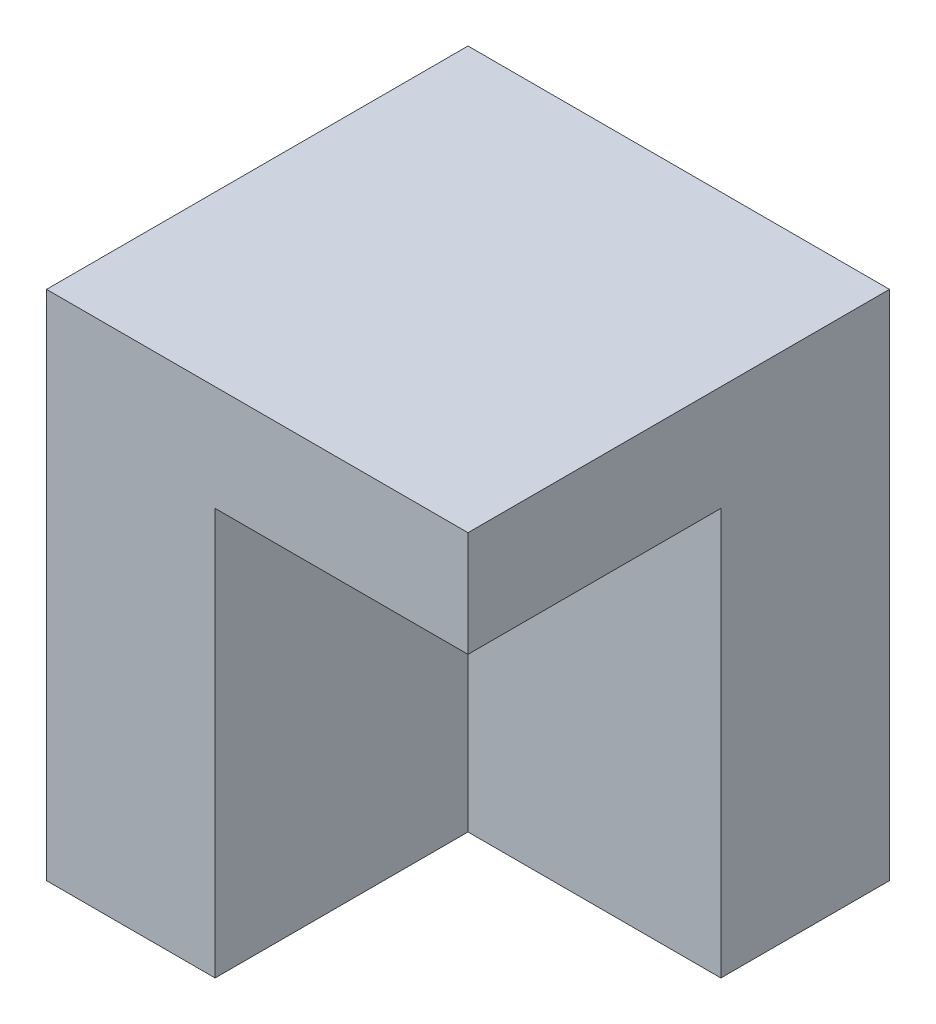
ISO-10303-21;
HEADER;
FILE_DESCRIPTION(('STEP AP214'),'2;1');
FILE_NAME('part.step','',(''),(''),'','','');
FILE_SCHEMA(('AUTOMOTIVE_DESIGN { 1 0 10303 214 1 1 1 1 }'));
ENDSEC;
DATA;
#1=APPLICATION_CONTEXT('core data for automotive mechanical design processes');
#2=APPLICATION_PROTOCOL_DEFINITION('international standard','automotive_design',2000,#1);
#3=PRODUCT_CONTEXT('',#1,'mechanical');
#4=PRODUCT('Part','Part','',(#3));
#5=PRODUCT_RELATED_PRODUCT_CATEGORY('part','',(#4));
#6=PRODUCT_DEFINITION_FORMATION('','',#4);
#7=PRODUCT_DEFINITION_CONTEXT('part definition',#1,'design');
#8=PRODUCT_DEFINITION('design','',#6,#7);
#9=PRODUCT_DEFINITION_SHAPE('','',#8);
#10=(LENGTH_UNIT() NAMED_UNIT(*) SI_UNIT(.MILLI.,.METRE.));
#11=(NAMED_UNIT(*) PLANE_ANGLE_UNIT() SI_UNIT($,.RADIAN.));
#12=(NAMED_UNIT(*) SI_UNIT($,.STERADIAN.) SOLID_ANGLE_UNIT());
#13=UNCERTAINTY_MEASURE_WITH_UNIT(LENGTH_MEASURE(1.E-05),#10,'distance_accuracy_value','');
#14=(GEOMETRIC_REPRESENTATION_CONTEXT(3) GLOBAL_UNCERTAINTY_ASSIGNED_CONTEXT((#13)) GLOBAL_UNIT_ASSIGNED_CONTEXT((#10,
#11,#12)) REPRESENTATION_CONTEXT('',''));
#15=CARTESIAN_POINT('',(0.,0.,0.));
#16=DIRECTION('',(0.,0.,1.));
#17=DIRECTION('',(1.,0.,0.));
#18=AXIS2_PLACEMENT_3D('',#15,#16,#17);
#19=CARTESIAN_POINT('',(0.,0.,0.));
#20=DIRECTION('',(0.,-1.,0.));
#21=DIRECTION('',(0.,0.,-1.));
#22=AXIS2_PLACEMENT_3D('',#19,#20,#21);
#23=PLANE('',#22);
#24=DIRECTION('',(1.,0.,0.));
#25=VECTOR('',#24,1.);
#26=CARTESIAN_POINT('',(10.,0.,4.));
#27=LINE('',#26,#25);
#28=CARTESIAN_POINT('',(4.,0.,4.));
#29=VERTEX_POINT('',#28);
#30=CARTESIAN_POINT('',(10.,0.,4.));
#31=VERTEX_POINT('',#30);
#32=EDGE_CURVE('E101',#29,#31,#27,.T.);
#33=ORIENTED_EDGE('',*,*,#32,.F.);
#34=DIRECTION('',(0.,0.,-1.));
#35=VECTOR('',#34,1.);
#36=CARTESIAN_POINT('',(4.,0.,10.));
#37=LINE('',#36,#35);
#38=CARTESIAN_POINT('',(4.,0.,10.));
#39=VERTEX_POINT('',#38);
#40=EDGE_CURVE('E88',#39,#29,#37,.T.);
#41=ORIENTED_EDGE('',*,*,#40,.F.);
#42=DIRECTION('',(1.,0.,0.));
#43=VECTOR('',#42,1.);
#44=CARTESIAN_POINT('',(4.,0.,10.));
#45=LINE('',#44,#43);
#46=CARTESIAN_POINT('',(0.,0.,10.));
#47=VERTEX_POINT('',#46);
#48=EDGE_CURVE('E83',#47,#39,#45,.T.);
#49=ORIENTED_EDGE('',*,*,#48,.F.);
#50=DIRECTION('',(0.,0.,1.));
#51=VECTOR('',#50,1.);
#52=CARTESIAN_POINT('',(0.,0.,10.));
#53=LINE('',#52,#51);
#54=CARTESIAN_POINT('',(0.,0.,0.));
#55=VERTEX_POINT('',#54);
#56=EDGE_CURVE('E124',#55,#47,#53,.T.);
#57=ORIENTED_EDGE('',*,*,#56,.F.);
#58=DIRECTION('',(-1.,0.,0.));
#59=VECTOR('',#58,1.);
#60=CARTESIAN_POINT('',(0.,0.,0.));
#61=LINE('',#60,#59);
#62=CARTESIAN_POINT('',(10.,0.,0.));
#63=VERTEX_POINT('',#62);
#64=EDGE_CURVE('E114',#63,#55,#61,.T.);
#65=ORIENTED_EDGE('',*,*,#64,.F.);
#66=DIRECTION('',(0.,0.,-1.));
#67=VECTOR('',#66,1.);
#68=CARTESIAN_POINT('',(10.,0.,0.));
#69=LINE('',#68,#67);
#70=EDGE_CURVE('E108',#31,#63,#69,.T.);
#71=ORIENTED_EDGE('',*,*,#70,.F.);
#72=EDGE_LOOP('',(#33,#41,#49,#57,#65,#71));
#73=FACE_BOUND('',#72,.T.);
#74=CARTESIAN_POINT('',(2.30294372515229,0.,2.30294372515229));
#75=DIRECTION('',(0.,1.,0.));
#76=DIRECTION('',(0.,0.,1.));
#77=AXIS2_PLACEMENT_3D('',#74,#75,#76);
#78=CIRCLE('',#77,1.39999999999999);
#79=CARTESIAN_POINT('',(2.30294372515229,0.,3.70294372515228));
#80=VERTEX_POINT('',#79);
#81=EDGE_CURVE('E110',#80,#80,#78,.T.);
#82=ORIENTED_EDGE('',*,*,#81,.T.);
#83=EDGE_LOOP('',(#82));
#84=FACE_BOUND('',#83,.T.);
#85=ADVANCED_FACE('F43',(#73,#84),#23,.T.);
#86=CARTESIAN_POINT('',(10.,9.65,4.));
#87=DIRECTION('',(0.,0.,-1.));
#88=DIRECTION('',(-1.,0.,0.));
#89=AXIS2_PLACEMENT_3D('',#86,#87,#88);
#90=PLANE('',#89);
#91=ORIENTED_EDGE('',*,*,#32,.T.);
#92=DIRECTION('',(0.,-1.,0.));
#93=VECTOR('',#92,1.);
#94=CARTESIAN_POINT('',(10.,9.65,4.));
#95=LINE('',#94,#93);
#96=CARTESIAN_POINT('',(10.,9.65,4.));
#97=VERTEX_POINT('',#96);
#98=EDGE_CURVE('E11',#97,#31,#95,.T.);
#99=ORIENTED_EDGE('',*,*,#98,.F.);
#100=DIRECTION('',(1.,0.,0.));
#101=VECTOR('',#100,1.);
#102=CARTESIAN_POINT('',(10.,9.65,4.));
#103=LINE('',#102,#101);
#104=CARTESIAN_POINT('',(4.,9.65,4.));
#105=VERTEX_POINT('',#104);
#106=EDGE_CURVE('E96',#105,#97,#103,.T.);
#107=ORIENTED_EDGE('',*,*,#106,.F.);
#108=DIRECTION('',(0.,-1.,0.));
#109=VECTOR('',#108,1.);
#110=CARTESIAN_POINT('',(4.,9.65,4.));
#111=LINE('',#110,#109);
#112=EDGE_CURVE('E91',#105,#29,#111,.T.);
#113=ORIENTED_EDGE('',*,*,#112,.T.);
#114=EDGE_LOOP('',(#91,#99,#107,#113));
#115=FACE_BOUND('',#114,.T.);
#116=ADVANCED_FACE('F46',(#115),#90,.F.);
#117=CARTESIAN_POINT('',(10.,9.65,0.));
#118=DIRECTION('',(-1.,0.,0.));
#119=DIRECTION('',(0.,0.,1.));
#120=AXIS2_PLACEMENT_3D('',#117,#118,#119);
#121=PLANE('',#120);
#122=ORIENTED_EDGE('',*,*,#70,.T.);
#123=DIRECTION('',(0.,-1.,0.));
#124=VECTOR('',#123,1.);
#125=CARTESIAN_POINT('',(10.,9.65,0.));
#126=LINE('',#125,#124);
#127=CARTESIAN_POINT('',(10.,12.15,0.));
#128=VERTEX_POINT('',#127);
#129=EDGE_CURVE('E54',#128,#63,#126,.T.);
#130=ORIENTED_EDGE('',*,*,#129,.F.);
#131=DIRECTION('',(0.,0.,-1.));
#132=VECTOR('',#131,1.);
#133=CARTESIAN_POINT('',(10.,12.15,0.));
#134=LINE('',#133,#132);
#135=CARTESIAN_POINT('',(10.,12.15,10.));
#136=VERTEX_POINT('',#135);
#137=EDGE_CURVE('E169',#136,#128,#134,.T.);
#138=ORIENTED_EDGE('',*,*,#137,.F.);
#139=DIRECTION('',(0.,-1.,0.));
#140=VECTOR('',#139,1.);
#141=CARTESIAN_POINT('',(10.,12.15,10.));
#142=LINE('',#141,#140);
#143=CARTESIAN_POINT('',(10.,9.65,10.));
#144=VERTEX_POINT('',#143);
#145=EDGE_CURVE('E164',#136,#144,#142,.T.);
#146=ORIENTED_EDGE('',*,*,#145,.T.);
#147=DIRECTION('',(0.,0.,-1.));
#148=VECTOR('',#147,1.);
#149=CARTESIAN_POINT('',(10.,9.65,0.));
#150=LINE('',#149,#148);
#151=EDGE_CURVE('E175',#144,#97,#150,.T.);
#152=ORIENTED_EDGE('',*,*,#151,.T.);
#153=ORIENTED_EDGE('',*,*,#98,.T.);
#154=EDGE_LOOP('',(#122,#130,#138,#146,#152,#153));
#155=FACE_BOUND('',#154,.T.);
#156=ADVANCED_FACE('F202',(#155),#121,.F.);
#157=CARTESIAN_POINT('',(0.,9.65,0.));
#158=DIRECTION('',(0.,0.,1.));
#159=DIRECTION('',(1.,0.,0.));
#160=AXIS2_PLACEMENT_3D('',#157,#158,#159);
#161=PLANE('',#160);
#162=ORIENTED_EDGE('',*,*,#64,.T.);
#163=DIRECTION('',(0.,-1.,0.));
#164=VECTOR('',#163,1.);
#165=CARTESIAN_POINT('',(0.,9.65,0.));
#166=LINE('',#165,#164);
#167=CARTESIAN_POINT('',(0.,12.15,0.));
#168=VERTEX_POINT('',#167);
#169=EDGE_CURVE('E134',#168,#55,#166,.T.);
#170=ORIENTED_EDGE('',*,*,#169,.F.);
#171=DIRECTION('',(-1.,0.,0.));
#172=VECTOR('',#171,1.);
#173=CARTESIAN_POINT('',(0.,12.15,0.));
#174=LINE('',#173,#172);
#175=EDGE_CURVE('E146',#128,#168,#174,.T.);
#176=ORIENTED_EDGE('',*,*,#175,.F.);
#177=ORIENTED_EDGE('',*,*,#129,.T.);
#178=EDGE_LOOP('',(#162,#170,#176,#177));
#179=FACE_BOUND('',#178,.T.);
#180=ADVANCED_FACE('F142',(#179),#161,.F.);
#181=CARTESIAN_POINT('',(0.,9.65,10.));
#182=DIRECTION('',(1.,0.,0.));
#183=DIRECTION('',(0.,0.,-1.));
#184=AXIS2_PLACEMENT_3D('',#181,#182,#183);
#185=PLANE('',#184);
#186=ORIENTED_EDGE('',*,*,#56,.T.);
#187=DIRECTION('',(0.,-1.,0.));
#188=VECTOR('',#187,1.);
#189=CARTESIAN_POINT('',(0.,9.65,10.));
#190=LINE('',#189,#188);
#191=CARTESIAN_POINT('',(0.,12.15,10.));
#192=VERTEX_POINT('',#191);
#193=EDGE_CURVE('E131',#192,#47,#190,.T.);
#194=ORIENTED_EDGE('',*,*,#193,.F.);
#195=DIRECTION('',(0.,0.,1.));
#196=VECTOR('',#195,1.);
#197=CARTESIAN_POINT('',(0.,12.15,0.));
#198=LINE('',#197,#196);
#199=EDGE_CURVE('E170',#168,#192,#198,.T.);
#200=ORIENTED_EDGE('',*,*,#199,.F.);
#201=ORIENTED_EDGE('',*,*,#169,.T.);
#202=EDGE_LOOP('',(#186,#194,#200,#201));
#203=FACE_BOUND('',#202,.T.);
#204=ADVANCED_FACE('F153',(#203),#185,.F.);
#205=CARTESIAN_POINT('',(4.,9.65,10.));
#206=DIRECTION('',(0.,0.,-1.));
#207=DIRECTION('',(-1.,0.,0.));
#208=AXIS2_PLACEMENT_3D('',#205,#206,#207);
#209=PLANE('',#208);
#210=ORIENTED_EDGE('',*,*,#48,.T.);
#211=DIRECTION('',(0.,-1.,0.));
#212=VECTOR('',#211,1.);
#213=CARTESIAN_POINT('',(4.,9.65,10.));
#214=LINE('',#213,#212);
#215=CARTESIAN_POINT('',(4.,9.65,10.));
#216=VERTEX_POINT('',#215);
#217=EDGE_CURVE('E62',#216,#39,#214,.T.);
#218=ORIENTED_EDGE('',*,*,#217,.F.);
#219=DIRECTION('',(1.,0.,0.));
#220=VECTOR('',#219,1.);
#221=CARTESIAN_POINT('',(0.,9.65,10.));
#222=LINE('',#221,#220);
#223=EDGE_CURVE('E179',#216,#144,#222,.T.);
#224=ORIENTED_EDGE('',*,*,#223,.T.);
#225=ORIENTED_EDGE('',*,*,#145,.F.);
#226=DIRECTION('',(1.,0.,0.));
#227=VECTOR('',#226,1.);
#228=CARTESIAN_POINT('',(0.,12.15,10.));
#229=LINE('',#228,#227);
#230=EDGE_CURVE('E160',#192,#136,#229,.T.);
#231=ORIENTED_EDGE('',*,*,#230,.F.);
#232=ORIENTED_EDGE('',*,*,#193,.T.);
#233=EDGE_LOOP('',(#210,#218,#224,#225,#231,#232));
#234=FACE_BOUND('',#233,.T.);
#235=ADVANCED_FACE('F157',(#234),#209,.F.);
#236=CARTESIAN_POINT('',(4.,9.65,10.));
#237=DIRECTION('',(-1.,0.,0.));
#238=DIRECTION('',(0.,0.,1.));
#239=AXIS2_PLACEMENT_3D('',#236,#237,#238);
#240=PLANE('',#239);
#241=ORIENTED_EDGE('',*,*,#40,.T.);
#242=ORIENTED_EDGE('',*,*,#112,.F.);
#243=DIRECTION('',(0.,0.,-1.));
#244=VECTOR('',#243,1.);
#245=CARTESIAN_POINT('',(4.,9.65,10.));
#246=LINE('',#245,#244);
#247=EDGE_CURVE('E104',#216,#105,#246,.T.);
#248=ORIENTED_EDGE('',*,*,#247,.F.);
#249=ORIENTED_EDGE('',*,*,#217,.T.);
#250=EDGE_LOOP('',(#241,#242,#248,#249));
#251=FACE_BOUND('',#250,.T.);
#252=ADVANCED_FACE('F90',(#251),#240,.F.);
#253=CARTESIAN_POINT('',(2.30294372515229,9.65,2.30294372515229));
#254=DIRECTION('',(0.,-1.,0.));
#255=DIRECTION('',(0.,0.,-1.));
#256=AXIS2_PLACEMENT_3D('',#253,#254,#255);
#257=CYLINDRICAL_SURFACE('',#256,1.39999999999999);
#258=CARTESIAN_POINT('',(2.30294372515229,9.65,2.30294372515229));
#259=DIRECTION('',(0.,1.,0.));
#260=DIRECTION('',(0.,0.,1.));
#261=AXIS2_PLACEMENT_3D('',#258,#259,#260);
#262=CIRCLE('',#261,1.39999999999999);
#263=CARTESIAN_POINT('',(2.30294372515229,9.65,3.70294372515228));
#264=VERTEX_POINT('',#263);
#265=EDGE_CURVE('E117',#264,#264,#262,.T.);
#266=ORIENTED_EDGE('',*,*,#265,.T.);
#267=EDGE_LOOP('',(#266));
#268=FACE_BOUND('',#267,.T.);
#269=ORIENTED_EDGE('',*,*,#81,.F.);
#270=EDGE_LOOP('',(#269));
#271=FACE_BOUND('',#270,.T.);
#272=ADVANCED_FACE('F218',(#268,#271),#257,.F.);
#273=CARTESIAN_POINT('',(0.,9.65,0.));
#274=DIRECTION('',(0.,1.,0.));
#275=DIRECTION('',(0.,0.,1.));
#276=AXIS2_PLACEMENT_3D('',#273,#274,#275);
#277=PLANE('',#276);
#278=ORIENTED_EDGE('',*,*,#265,.F.);
#279=EDGE_LOOP('',(#278));
#280=FACE_BOUND('',#279,.T.);
#281=ADVANCED_FACE('F244',(#280),#277,.F.);
#282=CARTESIAN_POINT('',(0.,12.15,0.));
#283=DIRECTION('',(0.,1.,0.));
#284=DIRECTION('',(0.,0.,1.));
#285=AXIS2_PLACEMENT_3D('',#282,#283,#284);
#286=PLANE('',#285);
#287=ORIENTED_EDGE('',*,*,#199,.T.);
#288=ORIENTED_EDGE('',*,*,#230,.T.);
#289=ORIENTED_EDGE('',*,*,#137,.T.);
#290=ORIENTED_EDGE('',*,*,#175,.T.);
#291=EDGE_LOOP('',(#287,#288,#289,#290));
#292=FACE_BOUND('',#291,.T.);
#293=ADVANCED_FACE('F172',(#292),#286,.T.);
#294=ORIENTED_EDGE('',*,*,#247,.T.);
#295=ORIENTED_EDGE('',*,*,#106,.T.);
#296=ORIENTED_EDGE('',*,*,#151,.F.);
#297=ORIENTED_EDGE('',*,*,#223,.F.);
#298=EDGE_LOOP('',(#294,#295,#296,#297));
#299=FACE_BOUND('',#298,.T.);
#300=ADVANCED_FACE('F197',(#299),#277,.F.);
#301=CLOSED_SHELL('',(#85,#116,#156,#180,#204,#235,#252,#272,#281,#293,#300));
#302=MANIFOLD_SOLID_BREP('B2',#301);
#303=ADVANCED_BREP_SHAPE_REPRESENTATION('',(#18,#302),#14);
#304=SHAPE_DEFINITION_REPRESENTATION(#9,#303);
ENDSEC;
END-ISO-10303-21;
